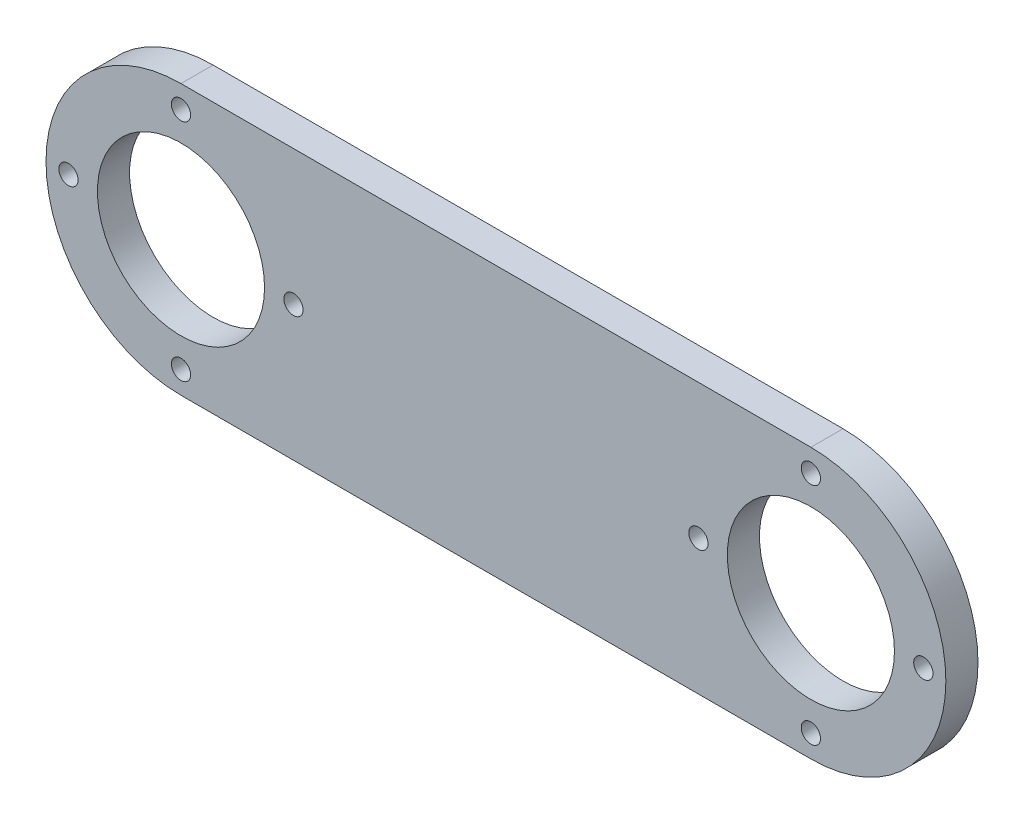
ISO-10303-21;
HEADER;
FILE_DESCRIPTION(('STEP AP214'),'2;1');
FILE_NAME('part.step','',(''),(''),'','','');
FILE_SCHEMA(('AUTOMOTIVE_DESIGN { 1 0 10303 214 1 1 1 1 }'));
ENDSEC;
DATA;
#1=APPLICATION_CONTEXT('core data for automotive mechanical design processes');
#2=APPLICATION_PROTOCOL_DEFINITION('international standard','automotive_design',2000,#1);
#3=PRODUCT_CONTEXT('',#1,'mechanical');
#4=PRODUCT('Part','Part','',(#3));
#5=PRODUCT_RELATED_PRODUCT_CATEGORY('part','',(#4));
#6=PRODUCT_DEFINITION_FORMATION('','',#4);
#7=PRODUCT_DEFINITION_CONTEXT('part definition',#1,'design');
#8=PRODUCT_DEFINITION('design','',#6,#7);
#9=PRODUCT_DEFINITION_SHAPE('','',#8);
#10=(LENGTH_UNIT() NAMED_UNIT(*) SI_UNIT(.MILLI.,.METRE.));
#11=(NAMED_UNIT(*) PLANE_ANGLE_UNIT() SI_UNIT($,.RADIAN.));
#12=(NAMED_UNIT(*) SI_UNIT($,.STERADIAN.) SOLID_ANGLE_UNIT());
#13=UNCERTAINTY_MEASURE_WITH_UNIT(LENGTH_MEASURE(1.E-05),#10,'distance_accuracy_value','');
#14=(GEOMETRIC_REPRESENTATION_CONTEXT(3) GLOBAL_UNCERTAINTY_ASSIGNED_CONTEXT((#13)) GLOBAL_UNIT_ASSIGNED_CONTEXT((#10,
#11,#12)) REPRESENTATION_CONTEXT('',''));
#15=CARTESIAN_POINT('',(0.,0.,0.));
#16=DIRECTION('',(0.,0.,1.));
#17=DIRECTION('',(1.,0.,0.));
#18=AXIS2_PLACEMENT_3D('',#15,#16,#17);
#19=CARTESIAN_POINT('',(49.,5.,5.));
#20=DIRECTION('',(0.,0.,1.));
#21=DIRECTION('',(1.,0.,0.));
#22=AXIS2_PLACEMENT_3D('',#19,#20,#21);
#23=PLANE('',#22);
#24=CARTESIAN_POINT('',(66.5,5.,5.));
#25=DIRECTION('',(0.,0.,1.));
#26=DIRECTION('',(1.,0.,0.));
#27=AXIS2_PLACEMENT_3D('',#24,#25,#26);
#28=CIRCLE('',#27,1.5);
#29=CARTESIAN_POINT('',(68.,5.,5.));
#30=VERTEX_POINT('',#29);
#31=EDGE_CURVE('E157',#30,#30,#28,.T.);
#32=ORIENTED_EDGE('',*,*,#31,.F.);
#33=EDGE_LOOP('',(#32));
#34=FACE_BOUND('',#33,.T.);
#35=CARTESIAN_POINT('',(31.5,5.,5.));
#36=DIRECTION('',(0.,0.,1.));
#37=DIRECTION('',(1.,0.,0.));
#38=AXIS2_PLACEMENT_3D('',#35,#36,#37);
#39=CIRCLE('',#38,1.5);
#40=CARTESIAN_POINT('',(33.,5.,5.));
#41=VERTEX_POINT('',#40);
#42=EDGE_CURVE('E145',#41,#41,#39,.T.);
#43=ORIENTED_EDGE('',*,*,#42,.F.);
#44=EDGE_LOOP('',(#43));
#45=FACE_BOUND('',#44,.T.);
#46=CARTESIAN_POINT('',(-49.0000000000001,-12.4999999999998,5.));
#47=DIRECTION('',(0.,0.,1.));
#48=DIRECTION('',(1.,0.,0.));
#49=AXIS2_PLACEMENT_3D('',#46,#47,#48);
#50=CIRCLE('',#49,1.5);
#51=CARTESIAN_POINT('',(-47.5000000000001,-12.4999999999998,5.));
#52=VERTEX_POINT('',#51);
#53=EDGE_CURVE('E133',#52,#52,#50,.T.);
#54=ORIENTED_EDGE('',*,*,#53,.F.);
#55=EDGE_LOOP('',(#54));
#56=FACE_BOUND('',#55,.T.);
#57=CARTESIAN_POINT('',(-49.0000000000001,22.5000000000002,5.));
#58=DIRECTION('',(0.,0.,1.));
#59=DIRECTION('',(1.,0.,0.));
#60=AXIS2_PLACEMENT_3D('',#57,#58,#59);
#61=CIRCLE('',#60,1.5);
#62=CARTESIAN_POINT('',(-47.5000000000001,22.5000000000002,5.));
#63=VERTEX_POINT('',#62);
#64=EDGE_CURVE('E121',#63,#63,#61,.T.);
#65=ORIENTED_EDGE('',*,*,#64,.F.);
#66=EDGE_LOOP('',(#65));
#67=FACE_BOUND('',#66,.T.);
#68=CARTESIAN_POINT('',(-49.0000000000001,5.00000000000018,5.));
#69=DIRECTION('',(0.,0.,1.));
#70=DIRECTION('',(1.,0.,0.));
#71=AXIS2_PLACEMENT_3D('',#68,#69,#70);
#72=CIRCLE('',#71,13.);
#73=CARTESIAN_POINT('',(-36.0000000000001,5.00000000000018,5.));
#74=VERTEX_POINT('',#73);
#75=EDGE_CURVE('E100',#74,#74,#72,.T.);
#76=ORIENTED_EDGE('',*,*,#75,.F.);
#77=EDGE_LOOP('',(#76));
#78=FACE_BOUND('',#77,.T.);
#79=CARTESIAN_POINT('',(49.,5.,5.));
#80=DIRECTION('',(0.,0.,1.));
#81=DIRECTION('',(1.,0.,0.));
#82=AXIS2_PLACEMENT_3D('',#79,#80,#81);
#83=CIRCLE('',#82,21.);
#84=CARTESIAN_POINT('',(49.,-16.,5.));
#85=VERTEX_POINT('',#84);
#86=CARTESIAN_POINT('',(49.,26.,5.));
#87=VERTEX_POINT('',#86);
#88=EDGE_CURVE('E85',#85,#87,#83,.T.);
#89=ORIENTED_EDGE('',*,*,#88,.T.);
#90=DIRECTION('',(-1.,0.,0.));
#91=VECTOR('',#90,1.);
#92=CARTESIAN_POINT('',(49.,26.,5.));
#93=LINE('',#92,#91);
#94=CARTESIAN_POINT('',(-49.,25.9999999999999,5.));
#95=VERTEX_POINT('',#94);
#96=EDGE_CURVE('E80',#87,#95,#93,.T.);
#97=ORIENTED_EDGE('',*,*,#96,.T.);
#98=CARTESIAN_POINT('',(-49.0000000000001,5.00000000000018,5.));
#99=DIRECTION('',(0.,0.,1.));
#100=DIRECTION('',(1.,0.,0.));
#101=AXIS2_PLACEMENT_3D('',#98,#99,#100);
#102=CIRCLE('',#101,21.);
#103=CARTESIAN_POINT('',(-49.,-15.9999999999998,5.));
#104=VERTEX_POINT('',#103);
#105=EDGE_CURVE('E83',#95,#104,#102,.T.);
#106=ORIENTED_EDGE('',*,*,#105,.T.);
#107=DIRECTION('',(1.,0.,0.));
#108=VECTOR('',#107,1.);
#109=CARTESIAN_POINT('',(-49.,-16.0000000000001,5.));
#110=LINE('',#109,#108);
#111=EDGE_CURVE('E50',#104,#85,#110,.T.);
#112=ORIENTED_EDGE('',*,*,#111,.T.);
#113=EDGE_LOOP('',(#89,#97,#106,#112));
#114=FACE_BOUND('',#113,.T.);
#115=CARTESIAN_POINT('',(-66.5000000000001,5.00000000000018,5.));
#116=DIRECTION('',(0.,0.,1.));
#117=DIRECTION('',(1.,0.,0.));
#118=AXIS2_PLACEMENT_3D('',#115,#116,#117);
#119=CIRCLE('',#118,1.5);
#120=CARTESIAN_POINT('',(-65.0000000000001,5.00000000000018,5.));
#121=VERTEX_POINT('',#120);
#122=EDGE_CURVE('E115',#121,#121,#119,.T.);
#123=ORIENTED_EDGE('',*,*,#122,.F.);
#124=EDGE_LOOP('',(#123));
#125=FACE_BOUND('',#124,.T.);
#126=CARTESIAN_POINT('',(-31.5000000000001,5.00000000000018,5.));
#127=DIRECTION('',(0.,0.,1.));
#128=DIRECTION('',(1.,0.,0.));
#129=AXIS2_PLACEMENT_3D('',#126,#127,#128);
#130=CIRCLE('',#129,1.5);
#131=CARTESIAN_POINT('',(-30.0000000000001,5.00000000000018,5.));
#132=VERTEX_POINT('',#131);
#133=EDGE_CURVE('E127',#132,#132,#130,.T.);
#134=ORIENTED_EDGE('',*,*,#133,.F.);
#135=EDGE_LOOP('',(#134));
#136=FACE_BOUND('',#135,.T.);
#137=CARTESIAN_POINT('',(49.,5.,5.));
#138=DIRECTION('',(0.,0.,1.));
#139=DIRECTION('',(1.,0.,0.));
#140=AXIS2_PLACEMENT_3D('',#137,#138,#139);
#141=CIRCLE('',#140,13.);
#142=CARTESIAN_POINT('',(62.,5.,5.));
#143=VERTEX_POINT('',#142);
#144=EDGE_CURVE('E139',#143,#143,#141,.T.);
#145=ORIENTED_EDGE('',*,*,#144,.F.);
#146=EDGE_LOOP('',(#145));
#147=FACE_BOUND('',#146,.T.);
#148=CARTESIAN_POINT('',(49.,22.5,5.));
#149=DIRECTION('',(0.,0.,1.));
#150=DIRECTION('',(1.,0.,0.));
#151=AXIS2_PLACEMENT_3D('',#148,#149,#150);
#152=CIRCLE('',#151,1.5);
#153=CARTESIAN_POINT('',(50.5,22.5,5.));
#154=VERTEX_POINT('',#153);
#155=EDGE_CURVE('E151',#154,#154,#152,.T.);
#156=ORIENTED_EDGE('',*,*,#155,.F.);
#157=EDGE_LOOP('',(#156));
#158=FACE_BOUND('',#157,.T.);
#159=CARTESIAN_POINT('',(49.,-12.5,5.));
#160=DIRECTION('',(0.,0.,1.));
#161=DIRECTION('',(1.,0.,0.));
#162=AXIS2_PLACEMENT_3D('',#159,#160,#161);
#163=CIRCLE('',#162,1.5);
#164=CARTESIAN_POINT('',(50.5,-12.5,5.));
#165=VERTEX_POINT('',#164);
#166=EDGE_CURVE('E163',#165,#165,#163,.T.);
#167=ORIENTED_EDGE('',*,*,#166,.F.);
#168=EDGE_LOOP('',(#167));
#169=FACE_BOUND('',#168,.T.);
#170=ADVANCED_FACE('F33',(#34,#45,#56,#67,#78,#114,#125,#136,#147,#158,#169),#23,.T.);
#171=CARTESIAN_POINT('',(49.,5.,0.));
#172=DIRECTION('',(0.,0.,1.));
#173=DIRECTION('',(1.,0.,0.));
#174=AXIS2_PLACEMENT_3D('',#171,#172,#173);
#175=PLANE('',#174);
#176=CARTESIAN_POINT('',(49.,5.,0.));
#177=DIRECTION('',(0.,0.,1.));
#178=DIRECTION('',(1.,0.,0.));
#179=AXIS2_PLACEMENT_3D('',#176,#177,#178);
#180=CIRCLE('',#179,21.);
#181=CARTESIAN_POINT('',(49.,-16.,0.));
#182=VERTEX_POINT('',#181);
#183=CARTESIAN_POINT('',(49.,26.,0.));
#184=VERTEX_POINT('',#183);
#185=EDGE_CURVE('E97',#182,#184,#180,.T.);
#186=ORIENTED_EDGE('',*,*,#185,.F.);
#187=DIRECTION('',(1.,0.,0.));
#188=VECTOR('',#187,1.);
#189=CARTESIAN_POINT('',(-49.,-16.0000000000001,0.));
#190=LINE('',#189,#188);
#191=CARTESIAN_POINT('',(-49.,-15.9999999999998,0.));
#192=VERTEX_POINT('',#191);
#193=EDGE_CURVE('E73',#192,#182,#190,.T.);
#194=ORIENTED_EDGE('',*,*,#193,.F.);
#195=CARTESIAN_POINT('',(-49.0000000000001,5.00000000000018,0.));
#196=DIRECTION('',(0.,0.,1.));
#197=DIRECTION('',(1.,0.,0.));
#198=AXIS2_PLACEMENT_3D('',#195,#196,#197);
#199=CIRCLE('',#198,21.);
#200=CARTESIAN_POINT('',(-49.,25.9999999999999,0.));
#201=VERTEX_POINT('',#200);
#202=EDGE_CURVE('E67',#201,#192,#199,.T.);
#203=ORIENTED_EDGE('',*,*,#202,.F.);
#204=DIRECTION('',(-1.,0.,0.));
#205=VECTOR('',#204,1.);
#206=CARTESIAN_POINT('',(49.,26.,0.));
#207=LINE('',#206,#205);
#208=EDGE_CURVE('E89',#184,#201,#207,.T.);
#209=ORIENTED_EDGE('',*,*,#208,.F.);
#210=EDGE_LOOP('',(#186,#194,#203,#209));
#211=FACE_BOUND('',#210,.T.);
#212=CARTESIAN_POINT('',(-49.0000000000001,5.00000000000018,0.));
#213=DIRECTION('',(0.,0.,1.));
#214=DIRECTION('',(1.,0.,0.));
#215=AXIS2_PLACEMENT_3D('',#212,#213,#214);
#216=CIRCLE('',#215,13.);
#217=CARTESIAN_POINT('',(-36.0000000000001,5.00000000000018,0.));
#218=VERTEX_POINT('',#217);
#219=EDGE_CURVE('E112',#218,#218,#216,.T.);
#220=ORIENTED_EDGE('',*,*,#219,.T.);
#221=EDGE_LOOP('',(#220));
#222=FACE_BOUND('',#221,.T.);
#223=CARTESIAN_POINT('',(-66.5000000000001,5.00000000000018,0.));
#224=DIRECTION('',(0.,0.,1.));
#225=DIRECTION('',(1.,0.,0.));
#226=AXIS2_PLACEMENT_3D('',#223,#224,#225);
#227=CIRCLE('',#226,1.5);
#228=CARTESIAN_POINT('',(-65.0000000000001,5.00000000000018,0.));
#229=VERTEX_POINT('',#228);
#230=EDGE_CURVE('E118',#229,#229,#227,.T.);
#231=ORIENTED_EDGE('',*,*,#230,.T.);
#232=EDGE_LOOP('',(#231));
#233=FACE_BOUND('',#232,.T.);
#234=CARTESIAN_POINT('',(-49.0000000000001,22.5000000000002,0.));
#235=DIRECTION('',(0.,0.,1.));
#236=DIRECTION('',(1.,0.,0.));
#237=AXIS2_PLACEMENT_3D('',#234,#235,#236);
#238=CIRCLE('',#237,1.5);
#239=CARTESIAN_POINT('',(-47.5000000000001,22.5000000000002,0.));
#240=VERTEX_POINT('',#239);
#241=EDGE_CURVE('E124',#240,#240,#238,.T.);
#242=ORIENTED_EDGE('',*,*,#241,.T.);
#243=EDGE_LOOP('',(#242));
#244=FACE_BOUND('',#243,.T.);
#245=CARTESIAN_POINT('',(-31.5000000000001,5.00000000000018,0.));
#246=DIRECTION('',(0.,0.,1.));
#247=DIRECTION('',(1.,0.,0.));
#248=AXIS2_PLACEMENT_3D('',#245,#246,#247);
#249=CIRCLE('',#248,1.5);
#250=CARTESIAN_POINT('',(-30.0000000000001,5.00000000000018,0.));
#251=VERTEX_POINT('',#250);
#252=EDGE_CURVE('E130',#251,#251,#249,.T.);
#253=ORIENTED_EDGE('',*,*,#252,.T.);
#254=EDGE_LOOP('',(#253));
#255=FACE_BOUND('',#254,.T.);
#256=CARTESIAN_POINT('',(-49.0000000000001,-12.4999999999998,0.));
#257=DIRECTION('',(0.,0.,1.));
#258=DIRECTION('',(1.,0.,0.));
#259=AXIS2_PLACEMENT_3D('',#256,#257,#258);
#260=CIRCLE('',#259,1.5);
#261=CARTESIAN_POINT('',(-47.5000000000001,-12.4999999999998,0.));
#262=VERTEX_POINT('',#261);
#263=EDGE_CURVE('E136',#262,#262,#260,.T.);
#264=ORIENTED_EDGE('',*,*,#263,.T.);
#265=EDGE_LOOP('',(#264));
#266=FACE_BOUND('',#265,.T.);
#267=CARTESIAN_POINT('',(49.,5.,0.));
#268=DIRECTION('',(0.,0.,1.));
#269=DIRECTION('',(1.,0.,0.));
#270=AXIS2_PLACEMENT_3D('',#267,#268,#269);
#271=CIRCLE('',#270,13.);
#272=CARTESIAN_POINT('',(62.,5.,0.));
#273=VERTEX_POINT('',#272);
#274=EDGE_CURVE('E142',#273,#273,#271,.T.);
#275=ORIENTED_EDGE('',*,*,#274,.T.);
#276=EDGE_LOOP('',(#275));
#277=FACE_BOUND('',#276,.T.);
#278=CARTESIAN_POINT('',(31.5,5.,0.));
#279=DIRECTION('',(0.,0.,1.));
#280=DIRECTION('',(1.,0.,0.));
#281=AXIS2_PLACEMENT_3D('',#278,#279,#280);
#282=CIRCLE('',#281,1.5);
#283=CARTESIAN_POINT('',(33.,5.,0.));
#284=VERTEX_POINT('',#283);
#285=EDGE_CURVE('E148',#284,#284,#282,.T.);
#286=ORIENTED_EDGE('',*,*,#285,.T.);
#287=EDGE_LOOP('',(#286));
#288=FACE_BOUND('',#287,.T.);
#289=CARTESIAN_POINT('',(49.,22.5,0.));
#290=DIRECTION('',(0.,0.,1.));
#291=DIRECTION('',(1.,0.,0.));
#292=AXIS2_PLACEMENT_3D('',#289,#290,#291);
#293=CIRCLE('',#292,1.5);
#294=CARTESIAN_POINT('',(50.5,22.5,0.));
#295=VERTEX_POINT('',#294);
#296=EDGE_CURVE('E154',#295,#295,#293,.T.);
#297=ORIENTED_EDGE('',*,*,#296,.T.);
#298=EDGE_LOOP('',(#297));
#299=FACE_BOUND('',#298,.T.);
#300=CARTESIAN_POINT('',(66.5,5.,0.));
#301=DIRECTION('',(0.,0.,1.));
#302=DIRECTION('',(1.,0.,0.));
#303=AXIS2_PLACEMENT_3D('',#300,#301,#302);
#304=CIRCLE('',#303,1.5);
#305=CARTESIAN_POINT('',(68.,5.,0.));
#306=VERTEX_POINT('',#305);
#307=EDGE_CURVE('E160',#306,#306,#304,.T.);
#308=ORIENTED_EDGE('',*,*,#307,.T.);
#309=EDGE_LOOP('',(#308));
#310=FACE_BOUND('',#309,.T.);
#311=CARTESIAN_POINT('',(49.,-12.5,0.));
#312=DIRECTION('',(0.,0.,1.));
#313=DIRECTION('',(1.,0.,0.));
#314=AXIS2_PLACEMENT_3D('',#311,#312,#313);
#315=CIRCLE('',#314,1.5);
#316=CARTESIAN_POINT('',(50.5,-12.5,0.));
#317=VERTEX_POINT('',#316);
#318=EDGE_CURVE('E166',#317,#317,#315,.T.);
#319=ORIENTED_EDGE('',*,*,#318,.T.);
#320=EDGE_LOOP('',(#319));
#321=FACE_BOUND('',#320,.T.);
#322=ADVANCED_FACE('F108',(#211,#222,#233,#244,#255,#266,#277,#288,#299,#310,#321),#175,.F.);
#323=CARTESIAN_POINT('',(49.,5.,5.));
#324=DIRECTION('',(0.,0.,-1.));
#325=DIRECTION('',(-1.,0.,0.));
#326=AXIS2_PLACEMENT_3D('',#323,#324,#325);
#327=CYLINDRICAL_SURFACE('',#326,21.);
#328=ORIENTED_EDGE('',*,*,#185,.T.);
#329=DIRECTION('',(0.,0.,-1.));
#330=VECTOR('',#329,1.);
#331=CARTESIAN_POINT('',(49.,26.,5.));
#332=LINE('',#331,#330);
#333=EDGE_CURVE('E11',#87,#184,#332,.T.);
#334=ORIENTED_EDGE('',*,*,#333,.F.);
#335=ORIENTED_EDGE('',*,*,#88,.F.);
#336=DIRECTION('',(0.,0.,-1.));
#337=VECTOR('',#336,1.);
#338=CARTESIAN_POINT('',(49.,-16.,5.));
#339=LINE('',#338,#337);
#340=EDGE_CURVE('E93',#85,#182,#339,.T.);
#341=ORIENTED_EDGE('',*,*,#340,.T.);
#342=EDGE_LOOP('',(#328,#334,#335,#341));
#343=FACE_BOUND('',#342,.T.);
#344=ADVANCED_FACE('F35',(#343),#327,.T.);
#345=CARTESIAN_POINT('',(49.,26.,5.));
#346=DIRECTION('',(0.,-1.,0.));
#347=DIRECTION('',(1.,0.,0.));
#348=AXIS2_PLACEMENT_3D('',#345,#346,#347);
#349=PLANE('',#348);
#350=ORIENTED_EDGE('',*,*,#208,.T.);
#351=DIRECTION('',(0.,0.,-1.));
#352=VECTOR('',#351,1.);
#353=CARTESIAN_POINT('',(-49.,25.9999999999999,5.));
#354=LINE('',#353,#352);
#355=EDGE_CURVE('E42',#95,#201,#354,.T.);
#356=ORIENTED_EDGE('',*,*,#355,.F.);
#357=ORIENTED_EDGE('',*,*,#96,.F.);
#358=ORIENTED_EDGE('',*,*,#333,.T.);
#359=EDGE_LOOP('',(#350,#356,#357,#358));
#360=FACE_BOUND('',#359,.T.);
#361=ADVANCED_FACE('F88',(#360),#349,.F.);
#362=CARTESIAN_POINT('',(-49.0000000000001,5.00000000000018,5.));
#363=DIRECTION('',(0.,0.,-1.));
#364=DIRECTION('',(-1.,0.,0.));
#365=AXIS2_PLACEMENT_3D('',#362,#363,#364);
#366=CYLINDRICAL_SURFACE('',#365,21.);
#367=ORIENTED_EDGE('',*,*,#202,.T.);
#368=DIRECTION('',(0.,0.,-1.));
#369=VECTOR('',#368,1.);
#370=CARTESIAN_POINT('',(-49.,-15.9999999999998,5.));
#371=LINE('',#370,#369);
#372=EDGE_CURVE('E90',#104,#192,#371,.T.);
#373=ORIENTED_EDGE('',*,*,#372,.F.);
#374=ORIENTED_EDGE('',*,*,#105,.F.);
#375=ORIENTED_EDGE('',*,*,#355,.T.);
#376=EDGE_LOOP('',(#367,#373,#374,#375));
#377=FACE_BOUND('',#376,.T.);
#378=ADVANCED_FACE('F91',(#377),#366,.T.);
#379=CARTESIAN_POINT('',(-49.,-16.0000000000001,5.));
#380=DIRECTION('',(0.,1.,0.));
#381=DIRECTION('',(-1.,0.,0.));
#382=AXIS2_PLACEMENT_3D('',#379,#380,#381);
#383=PLANE('',#382);
#384=ORIENTED_EDGE('',*,*,#193,.T.);
#385=ORIENTED_EDGE('',*,*,#340,.F.);
#386=ORIENTED_EDGE('',*,*,#111,.F.);
#387=ORIENTED_EDGE('',*,*,#372,.T.);
#388=EDGE_LOOP('',(#384,#385,#386,#387));
#389=FACE_BOUND('',#388,.T.);
#390=ADVANCED_FACE('F105',(#389),#383,.F.);
#391=CARTESIAN_POINT('',(-49.0000000000001,5.00000000000018,5.));
#392=DIRECTION('',(0.,0.,-1.));
#393=DIRECTION('',(-1.,0.,0.));
#394=AXIS2_PLACEMENT_3D('',#391,#392,#393);
#395=CYLINDRICAL_SURFACE('',#394,13.);
#396=ORIENTED_EDGE('',*,*,#75,.T.);
#397=EDGE_LOOP('',(#396));
#398=FACE_BOUND('',#397,.T.);
#399=ORIENTED_EDGE('',*,*,#219,.F.);
#400=EDGE_LOOP('',(#399));
#401=FACE_BOUND('',#400,.T.);
#402=ADVANCED_FACE('F185',(#398,#401),#395,.F.);
#403=CARTESIAN_POINT('',(-66.5000000000001,5.00000000000018,5.));
#404=DIRECTION('',(0.,0.,-1.));
#405=DIRECTION('',(-1.,0.,0.));
#406=AXIS2_PLACEMENT_3D('',#403,#404,#405);
#407=CYLINDRICAL_SURFACE('',#406,1.5);
#408=ORIENTED_EDGE('',*,*,#122,.T.);
#409=EDGE_LOOP('',(#408));
#410=FACE_BOUND('',#409,.T.);
#411=ORIENTED_EDGE('',*,*,#230,.F.);
#412=EDGE_LOOP('',(#411));
#413=FACE_BOUND('',#412,.T.);
#414=ADVANCED_FACE('F231',(#410,#413),#407,.F.);
#415=CARTESIAN_POINT('',(-49.0000000000001,22.5000000000002,5.));
#416=DIRECTION('',(0.,0.,-1.));
#417=DIRECTION('',(-1.,0.,0.));
#418=AXIS2_PLACEMENT_3D('',#415,#416,#417);
#419=CYLINDRICAL_SURFACE('',#418,1.5);
#420=ORIENTED_EDGE('',*,*,#64,.T.);
#421=EDGE_LOOP('',(#420));
#422=FACE_BOUND('',#421,.T.);
#423=ORIENTED_EDGE('',*,*,#241,.F.);
#424=EDGE_LOOP('',(#423));
#425=FACE_BOUND('',#424,.T.);
#426=ADVANCED_FACE('F239',(#422,#425),#419,.F.);
#427=CARTESIAN_POINT('',(-31.5000000000001,5.00000000000018,5.));
#428=DIRECTION('',(0.,0.,-1.));
#429=DIRECTION('',(-1.,0.,0.));
#430=AXIS2_PLACEMENT_3D('',#427,#428,#429);
#431=CYLINDRICAL_SURFACE('',#430,1.5);
#432=ORIENTED_EDGE('',*,*,#133,.T.);
#433=EDGE_LOOP('',(#432));
#434=FACE_BOUND('',#433,.T.);
#435=ORIENTED_EDGE('',*,*,#252,.F.);
#436=EDGE_LOOP('',(#435));
#437=FACE_BOUND('',#436,.T.);
#438=ADVANCED_FACE('F247',(#434,#437),#431,.F.);
#439=CARTESIAN_POINT('',(-49.0000000000001,-12.4999999999998,5.));
#440=DIRECTION('',(0.,0.,-1.));
#441=DIRECTION('',(-1.,0.,0.));
#442=AXIS2_PLACEMENT_3D('',#439,#440,#441);
#443=CYLINDRICAL_SURFACE('',#442,1.5);
#444=ORIENTED_EDGE('',*,*,#53,.T.);
#445=EDGE_LOOP('',(#444));
#446=FACE_BOUND('',#445,.T.);
#447=ORIENTED_EDGE('',*,*,#263,.F.);
#448=EDGE_LOOP('',(#447));
#449=FACE_BOUND('',#448,.T.);
#450=ADVANCED_FACE('F256',(#446,#449),#443,.F.);
#451=CARTESIAN_POINT('',(49.,5.,5.));
#452=DIRECTION('',(0.,0.,-1.));
#453=DIRECTION('',(-1.,0.,0.));
#454=AXIS2_PLACEMENT_3D('',#451,#452,#453);
#455=CYLINDRICAL_SURFACE('',#454,13.);
#456=ORIENTED_EDGE('',*,*,#144,.T.);
#457=EDGE_LOOP('',(#456));
#458=FACE_BOUND('',#457,.T.);
#459=ORIENTED_EDGE('',*,*,#274,.F.);
#460=EDGE_LOOP('',(#459));
#461=FACE_BOUND('',#460,.T.);
#462=ADVANCED_FACE('F265',(#458,#461),#455,.F.);
#463=CARTESIAN_POINT('',(31.5,5.,5.));
#464=DIRECTION('',(0.,0.,-1.));
#465=DIRECTION('',(-1.,0.,0.));
#466=AXIS2_PLACEMENT_3D('',#463,#464,#465);
#467=CYLINDRICAL_SURFACE('',#466,1.5);
#468=ORIENTED_EDGE('',*,*,#42,.T.);
#469=EDGE_LOOP('',(#468));
#470=FACE_BOUND('',#469,.T.);
#471=ORIENTED_EDGE('',*,*,#285,.F.);
#472=EDGE_LOOP('',(#471));
#473=FACE_BOUND('',#472,.T.);
#474=ADVANCED_FACE('F274',(#470,#473),#467,.F.);
#475=CARTESIAN_POINT('',(49.,22.5,5.));
#476=DIRECTION('',(0.,0.,-1.));
#477=DIRECTION('',(-1.,0.,0.));
#478=AXIS2_PLACEMENT_3D('',#475,#476,#477);
#479=CYLINDRICAL_SURFACE('',#478,1.5);
#480=ORIENTED_EDGE('',*,*,#155,.T.);
#481=EDGE_LOOP('',(#480));
#482=FACE_BOUND('',#481,.T.);
#483=ORIENTED_EDGE('',*,*,#296,.F.);
#484=EDGE_LOOP('',(#483));
#485=FACE_BOUND('',#484,.T.);
#486=ADVANCED_FACE('F283',(#482,#485),#479,.F.);
#487=CARTESIAN_POINT('',(66.5,5.,5.));
#488=DIRECTION('',(0.,0.,-1.));
#489=DIRECTION('',(-1.,0.,0.));
#490=AXIS2_PLACEMENT_3D('',#487,#488,#489);
#491=CYLINDRICAL_SURFACE('',#490,1.5);
#492=ORIENTED_EDGE('',*,*,#31,.T.);
#493=EDGE_LOOP('',(#492));
#494=FACE_BOUND('',#493,.T.);
#495=ORIENTED_EDGE('',*,*,#307,.F.);
#496=EDGE_LOOP('',(#495));
#497=FACE_BOUND('',#496,.T.);
#498=ADVANCED_FACE('F292',(#494,#497),#491,.F.);
#499=CARTESIAN_POINT('',(49.,-12.5,5.));
#500=DIRECTION('',(0.,0.,-1.));
#501=DIRECTION('',(-1.,0.,0.));
#502=AXIS2_PLACEMENT_3D('',#499,#500,#501);
#503=CYLINDRICAL_SURFACE('',#502,1.5);
#504=ORIENTED_EDGE('',*,*,#166,.T.);
#505=EDGE_LOOP('',(#504));
#506=FACE_BOUND('',#505,.T.);
#507=ORIENTED_EDGE('',*,*,#318,.F.);
#508=EDGE_LOOP('',(#507));
#509=FACE_BOUND('',#508,.T.);
#510=ADVANCED_FACE('F172',(#506,#509),#503,.F.);
#511=CLOSED_SHELL('',(#170,#322,#344,#361,#378,#390,#402,#414,#426,#438,#450,#462,#474,#486,
#498,#510));
#512=MANIFOLD_SOLID_BREP('B2',#511);
#513=ADVANCED_BREP_SHAPE_REPRESENTATION('',(#18,#512),#14);
#514=SHAPE_DEFINITION_REPRESENTATION(#9,#513);
ENDSEC;
END-ISO-10303-21;
